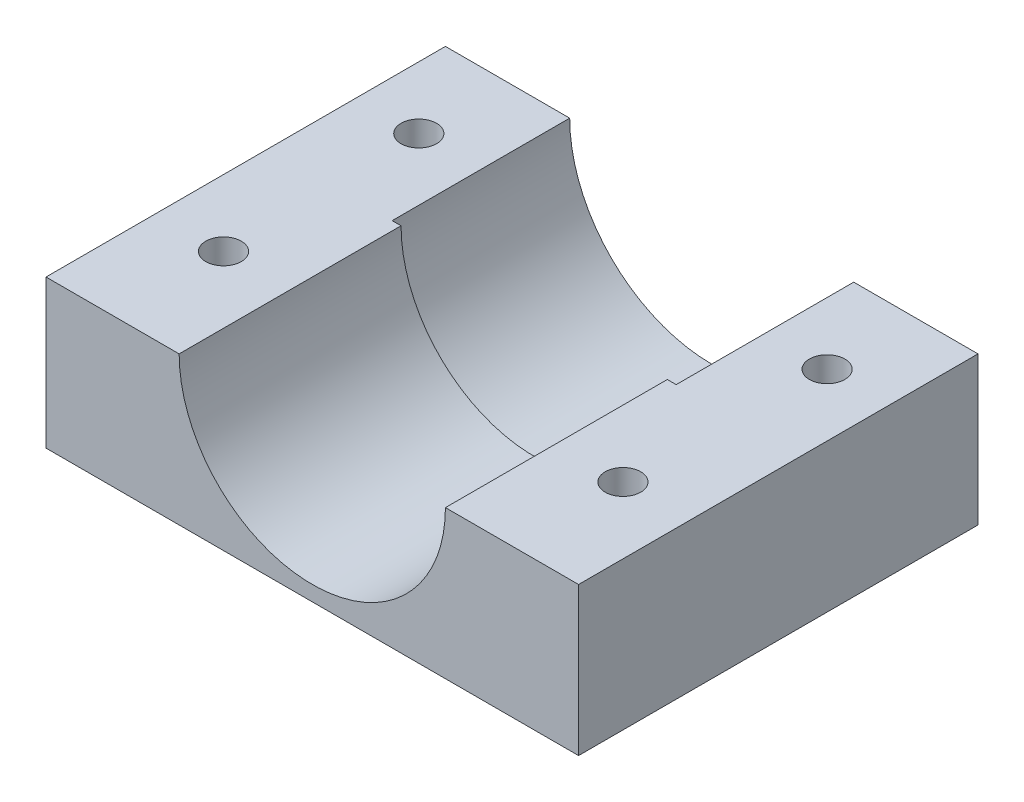
ISO-10303-21;
HEADER;
FILE_DESCRIPTION(('STEP AP214'),'2;1');
FILE_NAME('part.step','',(''),(''),'','','');
FILE_SCHEMA(('AUTOMOTIVE_DESIGN { 1 0 10303 214 1 1 1 1 }'));
ENDSEC;
DATA;
#1=APPLICATION_CONTEXT('core data for automotive mechanical design processes');
#2=APPLICATION_PROTOCOL_DEFINITION('international standard','automotive_design',2000,#1);
#3=PRODUCT_CONTEXT('',#1,'mechanical');
#4=PRODUCT('Part','Part','',(#3));
#5=PRODUCT_RELATED_PRODUCT_CATEGORY('part','',(#4));
#6=PRODUCT_DEFINITION_FORMATION('','',#4);
#7=PRODUCT_DEFINITION_CONTEXT('part definition',#1,'design');
#8=PRODUCT_DEFINITION('design','',#6,#7);
#9=PRODUCT_DEFINITION_SHAPE('','',#8);
#10=(LENGTH_UNIT() NAMED_UNIT(*) SI_UNIT(.MILLI.,.METRE.));
#11=(NAMED_UNIT(*) PLANE_ANGLE_UNIT() SI_UNIT($,.RADIAN.));
#12=(NAMED_UNIT(*) SI_UNIT($,.STERADIAN.) SOLID_ANGLE_UNIT());
#13=UNCERTAINTY_MEASURE_WITH_UNIT(LENGTH_MEASURE(1.E-05),#10,'distance_accuracy_value','');
#14=(GEOMETRIC_REPRESENTATION_CONTEXT(3) GLOBAL_UNCERTAINTY_ASSIGNED_CONTEXT((#13)) GLOBAL_UNIT_ASSIGNED_CONTEXT((#10,
#11,#12)) REPRESENTATION_CONTEXT('',''));
#15=CARTESIAN_POINT('',(0.,0.,0.));
#16=DIRECTION('',(0.,0.,1.));
#17=DIRECTION('',(1.,0.,0.));
#18=AXIS2_PLACEMENT_3D('',#15,#16,#17);
#19=CARTESIAN_POINT('',(-15.,0.,25.));
#20=DIRECTION('',(0.,-1.,0.));
#21=DIRECTION('',(0.,0.,-1.));
#22=AXIS2_PLACEMENT_3D('',#19,#20,#21);
#23=PLANE('',#22);
#24=CARTESIAN_POINT('',(-22.5,0.,12.5));
#25=DIRECTION('',(0.,-1.,0.));
#26=DIRECTION('',(0.,0.,-1.));
#27=AXIS2_PLACEMENT_3D('',#24,#25,#26);
#28=CIRCLE('',#27,2.);
#29=CARTESIAN_POINT('',(-22.5,0.,10.5));
#30=VERTEX_POINT('',#29);
#31=EDGE_CURVE('E182',#30,#30,#28,.F.);
#32=ORIENTED_EDGE('',*,*,#31,.F.);
#33=EDGE_LOOP('',(#32));
#34=FACE_BOUND('',#33,.T.);
#35=CARTESIAN_POINT('',(-23.,0.,-10.));
#36=DIRECTION('',(0.,-1.,0.));
#37=DIRECTION('',(0.,0.,-1.));
#38=AXIS2_PLACEMENT_3D('',#35,#36,#37);
#39=CIRCLE('',#38,2.00000000000001);
#40=CARTESIAN_POINT('',(-23.,0.,-12.));
#41=VERTEX_POINT('',#40);
#42=EDGE_CURVE('E137',#41,#41,#39,.F.);
#43=ORIENTED_EDGE('',*,*,#42,.F.);
#44=EDGE_LOOP('',(#43));
#45=FACE_BOUND('',#44,.T.);
#46=DIRECTION('',(-1.,0.,0.));
#47=VECTOR('',#46,1.);
#48=CARTESIAN_POINT('',(-15.,0.,0.));
#49=LINE('',#48,#47);
#50=CARTESIAN_POINT('',(-15.,0.,0.));
#51=VERTEX_POINT('',#50);
#52=CARTESIAN_POINT('',(-16.,0.,0.));
#53=VERTEX_POINT('',#52);
#54=EDGE_CURVE('E127',#51,#53,#49,.T.);
#55=ORIENTED_EDGE('',*,*,#54,.T.);
#56=DIRECTION('',(0.,0.,1.));
#57=VECTOR('',#56,1.);
#58=CARTESIAN_POINT('',(-16.,0.,-20.));
#59=LINE('',#58,#57);
#60=CARTESIAN_POINT('',(-16.,0.,-20.));
#61=VERTEX_POINT('',#60);
#62=EDGE_CURVE('E49',#61,#53,#59,.T.);
#63=ORIENTED_EDGE('',*,*,#62,.F.);
#64=DIRECTION('',(-1.,0.,0.));
#65=VECTOR('',#64,1.);
#66=CARTESIAN_POINT('',(-20.,0.,-20.));
#67=LINE('',#66,#65);
#68=CARTESIAN_POINT('',(-30.,0.,-20.));
#69=VERTEX_POINT('',#68);
#70=EDGE_CURVE('E189',#61,#69,#67,.T.);
#71=ORIENTED_EDGE('',*,*,#70,.T.);
#72=DIRECTION('',(0.,0.,-1.));
#73=VECTOR('',#72,1.);
#74=CARTESIAN_POINT('',(-30.,0.,25.));
#75=LINE('',#74,#73);
#76=CARTESIAN_POINT('',(-30.,0.,25.));
#77=VERTEX_POINT('',#76);
#78=EDGE_CURVE('E11',#77,#69,#75,.T.);
#79=ORIENTED_EDGE('',*,*,#78,.F.);
#80=DIRECTION('',(-1.,0.,0.));
#81=VECTOR('',#80,1.);
#82=CARTESIAN_POINT('',(-15.,0.,25.));
#83=LINE('',#82,#81);
#84=CARTESIAN_POINT('',(-15.,0.,25.));
#85=VERTEX_POINT('',#84);
#86=EDGE_CURVE('E79',#85,#77,#83,.T.);
#87=ORIENTED_EDGE('',*,*,#86,.F.);
#88=DIRECTION('',(0.,0.,-1.));
#89=VECTOR('',#88,1.);
#90=CARTESIAN_POINT('',(-15.,0.,25.));
#91=LINE('',#90,#89);
#92=EDGE_CURVE('E58',#85,#51,#91,.T.);
#93=ORIENTED_EDGE('',*,*,#92,.T.);
#94=EDGE_LOOP('',(#55,#63,#71,#79,#87,#93));
#95=FACE_BOUND('',#94,.T.);
#96=ADVANCED_FACE('F33',(#34,#45,#95),#23,.F.);
#97=CARTESIAN_POINT('',(-30.,-16.6968195138679,25.));
#98=DIRECTION('',(-1.,0.,0.));
#99=DIRECTION('',(0.,0.,1.));
#100=AXIS2_PLACEMENT_3D('',#97,#98,#99);
#101=PLANE('',#100);
#102=ORIENTED_EDGE('',*,*,#78,.T.);
#103=DIRECTION('',(0.,-1.,0.));
#104=VECTOR('',#103,1.);
#105=CARTESIAN_POINT('',(-30.,-16.6968195138679,-20.));
#106=LINE('',#105,#104);
#107=CARTESIAN_POINT('',(-30.,-16.6968195138679,-20.));
#108=VERTEX_POINT('',#107);
#109=EDGE_CURVE('E199',#69,#108,#106,.T.);
#110=ORIENTED_EDGE('',*,*,#109,.T.);
#111=DIRECTION('',(0.,0.,-1.));
#112=VECTOR('',#111,1.);
#113=CARTESIAN_POINT('',(-30.,-16.6968195138679,25.));
#114=LINE('',#113,#112);
#115=CARTESIAN_POINT('',(-30.,-16.6968195138679,25.));
#116=VERTEX_POINT('',#115);
#117=EDGE_CURVE('E41',#116,#108,#114,.T.);
#118=ORIENTED_EDGE('',*,*,#117,.F.);
#119=DIRECTION('',(0.,1.,0.));
#120=VECTOR('',#119,1.);
#121=CARTESIAN_POINT('',(-30.,-16.6968195138679,25.));
#122=LINE('',#121,#120);
#123=EDGE_CURVE('E144',#116,#77,#122,.T.);
#124=ORIENTED_EDGE('',*,*,#123,.T.);
#125=EDGE_LOOP('',(#102,#110,#118,#124));
#126=FACE_BOUND('',#125,.T.);
#127=ADVANCED_FACE('F173',(#126),#101,.T.);
#128=CARTESIAN_POINT('',(30.,-16.6968195138679,25.));
#129=DIRECTION('',(0.,-1.,0.));
#130=DIRECTION('',(0.,0.,-1.));
#131=AXIS2_PLACEMENT_3D('',#128,#129,#130);
#132=PLANE('',#131);
#133=CARTESIAN_POINT('',(23.,-16.6968195138679,-10.));
#134=DIRECTION('',(0.,-1.,0.));
#135=DIRECTION('',(0.,0.,1.));
#136=AXIS2_PLACEMENT_3D('',#133,#134,#135);
#137=CIRCLE('',#136,2.00000000000001);
#138=CARTESIAN_POINT('',(23.,-16.6968195138679,-7.99999999999999));
#139=VERTEX_POINT('',#138);
#140=EDGE_CURVE('E230',#139,#139,#137,.T.);
#141=ORIENTED_EDGE('',*,*,#140,.F.);
#142=EDGE_LOOP('',(#141));
#143=FACE_BOUND('',#142,.T.);
#144=CARTESIAN_POINT('',(22.5,-16.6968195138679,12.5));
#145=DIRECTION('',(0.,-1.,0.));
#146=DIRECTION('',(0.,0.,1.));
#147=AXIS2_PLACEMENT_3D('',#144,#145,#146);
#148=CIRCLE('',#147,2.);
#149=CARTESIAN_POINT('',(22.5,-16.6968195138679,14.5));
#150=VERTEX_POINT('',#149);
#151=EDGE_CURVE('E224',#150,#150,#148,.T.);
#152=ORIENTED_EDGE('',*,*,#151,.F.);
#153=EDGE_LOOP('',(#152));
#154=FACE_BOUND('',#153,.T.);
#155=CARTESIAN_POINT('',(-22.5,-16.6968195138679,12.5));
#156=DIRECTION('',(0.,-1.,0.));
#157=DIRECTION('',(0.,0.,-1.));
#158=AXIS2_PLACEMENT_3D('',#155,#156,#157);
#159=CIRCLE('',#158,2.);
#160=CARTESIAN_POINT('',(-22.5,-16.6968195138679,10.5));
#161=VERTEX_POINT('',#160);
#162=EDGE_CURVE('E218',#161,#161,#159,.T.);
#163=ORIENTED_EDGE('',*,*,#162,.F.);
#164=EDGE_LOOP('',(#163));
#165=FACE_BOUND('',#164,.T.);
#166=CARTESIAN_POINT('',(-23.,-16.6968195138679,-10.));
#167=DIRECTION('',(0.,-1.,0.));
#168=DIRECTION('',(0.,0.,-1.));
#169=AXIS2_PLACEMENT_3D('',#166,#167,#168);
#170=CIRCLE('',#169,2.00000000000001);
#171=CARTESIAN_POINT('',(-23.,-16.6968195138679,-12.));
#172=VERTEX_POINT('',#171);
#173=EDGE_CURVE('E214',#172,#172,#170,.T.);
#174=ORIENTED_EDGE('',*,*,#173,.F.);
#175=EDGE_LOOP('',(#174));
#176=FACE_BOUND('',#175,.T.);
#177=ORIENTED_EDGE('',*,*,#117,.T.);
#178=DIRECTION('',(1.,0.,0.));
#179=VECTOR('',#178,1.);
#180=CARTESIAN_POINT('',(30.,-16.6968195138679,-20.));
#181=LINE('',#180,#179);
#182=CARTESIAN_POINT('',(30.,-16.6968195138679,-20.));
#183=VERTEX_POINT('',#182);
#184=EDGE_CURVE('E153',#108,#183,#181,.T.);
#185=ORIENTED_EDGE('',*,*,#184,.T.);
#186=DIRECTION('',(0.,0.,-1.));
#187=VECTOR('',#186,1.);
#188=CARTESIAN_POINT('',(30.,-16.6968195138679,25.));
#189=LINE('',#188,#187);
#190=CARTESIAN_POINT('',(30.,-16.6968195138679,25.));
#191=VERTEX_POINT('',#190);
#192=EDGE_CURVE('E112',#191,#183,#189,.T.);
#193=ORIENTED_EDGE('',*,*,#192,.F.);
#194=DIRECTION('',(-1.,0.,0.));
#195=VECTOR('',#194,1.);
#196=CARTESIAN_POINT('',(30.,-16.6968195138679,25.));
#197=LINE('',#196,#195);
#198=EDGE_CURVE('E99',#191,#116,#197,.T.);
#199=ORIENTED_EDGE('',*,*,#198,.T.);
#200=EDGE_LOOP('',(#177,#185,#193,#199));
#201=FACE_BOUND('',#200,.T.);
#202=ADVANCED_FACE('F148',(#143,#154,#165,#176,#201),#132,.T.);
#203=CARTESIAN_POINT('',(30.,-16.6968195138679,25.));
#204=DIRECTION('',(-1.,0.,0.));
#205=DIRECTION('',(0.,0.,1.));
#206=AXIS2_PLACEMENT_3D('',#203,#204,#205);
#207=PLANE('',#206);
#208=ORIENTED_EDGE('',*,*,#192,.T.);
#209=DIRECTION('',(0.,1.,0.));
#210=VECTOR('',#209,1.);
#211=CARTESIAN_POINT('',(30.,0.,-20.));
#212=LINE('',#211,#210);
#213=CARTESIAN_POINT('',(30.,0.,-20.));
#214=VERTEX_POINT('',#213);
#215=EDGE_CURVE('E108',#183,#214,#212,.T.);
#216=ORIENTED_EDGE('',*,*,#215,.T.);
#217=DIRECTION('',(0.,0.,-1.));
#218=VECTOR('',#217,1.);
#219=CARTESIAN_POINT('',(30.,0.,25.));
#220=LINE('',#219,#218);
#221=CARTESIAN_POINT('',(30.,0.,25.));
#222=VERTEX_POINT('',#221);
#223=EDGE_CURVE('E105',#222,#214,#220,.T.);
#224=ORIENTED_EDGE('',*,*,#223,.F.);
#225=DIRECTION('',(0.,1.,0.));
#226=VECTOR('',#225,1.);
#227=CARTESIAN_POINT('',(30.,-16.6968195138679,25.));
#228=LINE('',#227,#226);
#229=EDGE_CURVE('E92',#191,#222,#228,.T.);
#230=ORIENTED_EDGE('',*,*,#229,.F.);
#231=EDGE_LOOP('',(#208,#216,#224,#230));
#232=FACE_BOUND('',#231,.T.);
#233=ADVANCED_FACE('F106',(#232),#207,.F.);
#234=CARTESIAN_POINT('',(30.,0.,25.));
#235=DIRECTION('',(0.,-1.,0.));
#236=DIRECTION('',(1.,0.,0.));
#237=AXIS2_PLACEMENT_3D('',#234,#235,#236);
#238=PLANE('',#237);
#239=CARTESIAN_POINT('',(23.,0.,-10.));
#240=DIRECTION('',(0.,-1.,0.));
#241=DIRECTION('',(0.,0.,-1.));
#242=AXIS2_PLACEMENT_3D('',#239,#240,#241);
#243=CIRCLE('',#242,2.00000000000001);
#244=CARTESIAN_POINT('',(23.,0.,-12.));
#245=VERTEX_POINT('',#244);
#246=EDGE_CURVE('E227',#245,#245,#243,.F.);
#247=ORIENTED_EDGE('',*,*,#246,.F.);
#248=EDGE_LOOP('',(#247));
#249=FACE_BOUND('',#248,.T.);
#250=CARTESIAN_POINT('',(22.5,0.,12.5));
#251=DIRECTION('',(0.,-1.,0.));
#252=DIRECTION('',(0.,0.,-1.));
#253=AXIS2_PLACEMENT_3D('',#250,#251,#252);
#254=CIRCLE('',#253,2.);
#255=CARTESIAN_POINT('',(22.5,0.,10.5));
#256=VERTEX_POINT('',#255);
#257=EDGE_CURVE('E221',#256,#256,#254,.F.);
#258=ORIENTED_EDGE('',*,*,#257,.F.);
#259=EDGE_LOOP('',(#258));
#260=FACE_BOUND('',#259,.T.);
#261=ORIENTED_EDGE('',*,*,#223,.T.);
#262=DIRECTION('',(-1.,0.,0.));
#263=VECTOR('',#262,1.);
#264=CARTESIAN_POINT('',(20.,0.,-20.));
#265=LINE('',#264,#263);
#266=CARTESIAN_POINT('',(16.,0.,-20.));
#267=VERTEX_POINT('',#266);
#268=EDGE_CURVE('E136',#214,#267,#265,.T.);
#269=ORIENTED_EDGE('',*,*,#268,.T.);
#270=DIRECTION('',(0.,0.,1.));
#271=VECTOR('',#270,1.);
#272=CARTESIAN_POINT('',(16.,0.,-20.));
#273=LINE('',#272,#271);
#274=CARTESIAN_POINT('',(16.,0.,0.));
#275=VERTEX_POINT('',#274);
#276=EDGE_CURVE('E193',#267,#275,#273,.T.);
#277=ORIENTED_EDGE('',*,*,#276,.T.);
#278=DIRECTION('',(-1.,0.,0.));
#279=VECTOR('',#278,1.);
#280=CARTESIAN_POINT('',(30.,0.,0.));
#281=LINE('',#280,#279);
#282=CARTESIAN_POINT('',(15.,0.,0.));
#283=VERTEX_POINT('',#282);
#284=EDGE_CURVE('E129',#275,#283,#281,.T.);
#285=ORIENTED_EDGE('',*,*,#284,.T.);
#286=DIRECTION('',(0.,0.,-1.));
#287=VECTOR('',#286,1.);
#288=CARTESIAN_POINT('',(15.,0.,25.));
#289=LINE('',#288,#287);
#290=CARTESIAN_POINT('',(15.,0.,25.));
#291=VERTEX_POINT('',#290);
#292=EDGE_CURVE('E113',#291,#283,#289,.T.);
#293=ORIENTED_EDGE('',*,*,#292,.F.);
#294=DIRECTION('',(-1.,0.,0.));
#295=VECTOR('',#294,1.);
#296=CARTESIAN_POINT('',(30.,0.,25.));
#297=LINE('',#296,#295);
#298=EDGE_CURVE('E96',#222,#291,#297,.T.);
#299=ORIENTED_EDGE('',*,*,#298,.F.);
#300=EDGE_LOOP('',(#261,#269,#277,#285,#293,#299));
#301=FACE_BOUND('',#300,.T.);
#302=ADVANCED_FACE('F115',(#249,#260,#301),#238,.F.);
#303=CARTESIAN_POINT('',(0.,0.,25.));
#304=DIRECTION('',(0.,0.,-1.));
#305=DIRECTION('',(-1.,0.,0.));
#306=AXIS2_PLACEMENT_3D('',#303,#304,#305);
#307=CYLINDRICAL_SURFACE('',#306,15.);
#308=CARTESIAN_POINT('',(0.,0.,0.));
#309=DIRECTION('',(0.,0.,1.));
#310=DIRECTION('',(1.,0.,0.));
#311=AXIS2_PLACEMENT_3D('',#308,#309,#310);
#312=CIRCLE('',#311,15.);
#313=EDGE_CURVE('E132',#51,#283,#312,.T.);
#314=ORIENTED_EDGE('',*,*,#313,.F.);
#315=ORIENTED_EDGE('',*,*,#92,.F.);
#316=CARTESIAN_POINT('',(0.,0.,25.));
#317=DIRECTION('',(0.,0.,1.));
#318=DIRECTION('',(1.,0.,0.));
#319=AXIS2_PLACEMENT_3D('',#316,#317,#318);
#320=CIRCLE('',#319,15.);
#321=EDGE_CURVE('E117',#85,#291,#320,.T.);
#322=ORIENTED_EDGE('',*,*,#321,.T.);
#323=ORIENTED_EDGE('',*,*,#292,.T.);
#324=EDGE_LOOP('',(#314,#315,#322,#323));
#325=FACE_BOUND('',#324,.T.);
#326=ADVANCED_FACE('F161',(#325),#307,.F.);
#327=CARTESIAN_POINT('',(0.,0.,25.));
#328=DIRECTION('',(0.,0.,1.));
#329=DIRECTION('',(1.,0.,0.));
#330=AXIS2_PLACEMENT_3D('',#327,#328,#329);
#331=PLANE('',#330);
#332=ORIENTED_EDGE('',*,*,#86,.T.);
#333=ORIENTED_EDGE('',*,*,#123,.F.);
#334=ORIENTED_EDGE('',*,*,#198,.F.);
#335=ORIENTED_EDGE('',*,*,#229,.T.);
#336=ORIENTED_EDGE('',*,*,#298,.T.);
#337=ORIENTED_EDGE('',*,*,#321,.F.);
#338=EDGE_LOOP('',(#332,#333,#334,#335,#336,#337));
#339=FACE_BOUND('',#338,.T.);
#340=ADVANCED_FACE('F94',(#339),#331,.T.);
#341=CARTESIAN_POINT('',(0.,0.,0.));
#342=DIRECTION('',(0.,0.,1.));
#343=DIRECTION('',(1.,0.,0.));
#344=AXIS2_PLACEMENT_3D('',#341,#342,#343);
#345=PLANE('',#344);
#346=ORIENTED_EDGE('',*,*,#284,.F.);
#347=CARTESIAN_POINT('',(0.,0.,0.));
#348=DIRECTION('',(0.,0.,-1.));
#349=DIRECTION('',(1.,0.,0.));
#350=AXIS2_PLACEMENT_3D('',#347,#348,#349);
#351=CIRCLE('',#350,16.);
#352=EDGE_CURVE('E133',#275,#53,#351,.T.);
#353=ORIENTED_EDGE('',*,*,#352,.T.);
#354=ORIENTED_EDGE('',*,*,#54,.F.);
#355=ORIENTED_EDGE('',*,*,#313,.T.);
#356=EDGE_LOOP('',(#346,#353,#354,#355));
#357=FACE_BOUND('',#356,.T.);
#358=ADVANCED_FACE('F160',(#357),#345,.F.);
#359=CARTESIAN_POINT('',(0.,0.,-20.));
#360=DIRECTION('',(0.,0.,1.));
#361=DIRECTION('',(1.,0.,0.));
#362=AXIS2_PLACEMENT_3D('',#359,#360,#361);
#363=CYLINDRICAL_SURFACE('',#362,16.);
#364=ORIENTED_EDGE('',*,*,#352,.F.);
#365=ORIENTED_EDGE('',*,*,#276,.F.);
#366=CARTESIAN_POINT('',(0.,0.,-20.));
#367=DIRECTION('',(0.,0.,-1.));
#368=DIRECTION('',(1.,0.,0.));
#369=AXIS2_PLACEMENT_3D('',#366,#367,#368);
#370=CIRCLE('',#369,16.);
#371=EDGE_CURVE('E197',#267,#61,#370,.T.);
#372=ORIENTED_EDGE('',*,*,#371,.T.);
#373=ORIENTED_EDGE('',*,*,#62,.T.);
#374=EDGE_LOOP('',(#364,#365,#372,#373));
#375=FACE_BOUND('',#374,.T.);
#376=ADVANCED_FACE('F202',(#375),#363,.F.);
#377=CARTESIAN_POINT('',(0.,0.,-20.));
#378=DIRECTION('',(0.,0.,1.));
#379=DIRECTION('',(1.,0.,0.));
#380=AXIS2_PLACEMENT_3D('',#377,#378,#379);
#381=PLANE('',#380);
#382=ORIENTED_EDGE('',*,*,#268,.F.);
#383=ORIENTED_EDGE('',*,*,#215,.F.);
#384=ORIENTED_EDGE('',*,*,#184,.F.);
#385=ORIENTED_EDGE('',*,*,#109,.F.);
#386=ORIENTED_EDGE('',*,*,#70,.F.);
#387=ORIENTED_EDGE('',*,*,#371,.F.);
#388=EDGE_LOOP('',(#382,#383,#384,#385,#386,#387));
#389=FACE_BOUND('',#388,.T.);
#390=ADVANCED_FACE('F196',(#389),#381,.F.);
#391=CARTESIAN_POINT('',(-23.,5.65685424949239,-10.));
#392=DIRECTION('',(0.,-1.,0.));
#393=DIRECTION('',(0.,0.,-1.));
#394=AXIS2_PLACEMENT_3D('',#391,#392,#393);
#395=CYLINDRICAL_SURFACE('',#394,2.00000000000001);
#396=ORIENTED_EDGE('',*,*,#42,.T.);
#397=EDGE_LOOP('',(#396));
#398=FACE_BOUND('',#397,.T.);
#399=ORIENTED_EDGE('',*,*,#173,.T.);
#400=EDGE_LOOP('',(#399));
#401=FACE_BOUND('',#400,.T.);
#402=ADVANCED_FACE('F245',(#398,#401),#395,.F.);
#403=CARTESIAN_POINT('',(-22.5,5.65685424949239,12.5));
#404=DIRECTION('',(0.,-1.,0.));
#405=DIRECTION('',(0.,0.,-1.));
#406=AXIS2_PLACEMENT_3D('',#403,#404,#405);
#407=CYLINDRICAL_SURFACE('',#406,2.);
#408=ORIENTED_EDGE('',*,*,#31,.T.);
#409=EDGE_LOOP('',(#408));
#410=FACE_BOUND('',#409,.T.);
#411=ORIENTED_EDGE('',*,*,#162,.T.);
#412=EDGE_LOOP('',(#411));
#413=FACE_BOUND('',#412,.T.);
#414=ADVANCED_FACE('F247',(#410,#413),#407,.F.);
#415=CARTESIAN_POINT('',(22.5,5.65685424949239,12.5));
#416=DIRECTION('',(0.,-1.,0.));
#417=DIRECTION('',(0.,0.,-1.));
#418=AXIS2_PLACEMENT_3D('',#415,#416,#417);
#419=CYLINDRICAL_SURFACE('',#418,2.);
#420=ORIENTED_EDGE('',*,*,#257,.T.);
#421=EDGE_LOOP('',(#420));
#422=FACE_BOUND('',#421,.T.);
#423=ORIENTED_EDGE('',*,*,#151,.T.);
#424=EDGE_LOOP('',(#423));
#425=FACE_BOUND('',#424,.T.);
#426=ADVANCED_FACE('F254',(#422,#425),#419,.F.);
#427=CARTESIAN_POINT('',(23.,5.65685424949239,-10.));
#428=DIRECTION('',(0.,-1.,0.));
#429=DIRECTION('',(0.,0.,-1.));
#430=AXIS2_PLACEMENT_3D('',#427,#428,#429);
#431=CYLINDRICAL_SURFACE('',#430,2.00000000000001);
#432=ORIENTED_EDGE('',*,*,#246,.T.);
#433=EDGE_LOOP('',(#432));
#434=FACE_BOUND('',#433,.T.);
#435=ORIENTED_EDGE('',*,*,#140,.T.);
#436=EDGE_LOOP('',(#435));
#437=FACE_BOUND('',#436,.T.);
#438=ADVANCED_FACE('F234',(#434,#437),#431,.F.);
#439=CLOSED_SHELL('',(#96,#127,#202,#233,#302,#326,#340,#358,#376,#390,#402,#414,#426,#438));
#440=MANIFOLD_SOLID_BREP('B2',#439);
#441=ADVANCED_BREP_SHAPE_REPRESENTATION('',(#18,#440),#14);
#442=SHAPE_DEFINITION_REPRESENTATION(#9,#441);
ENDSEC;
END-ISO-10303-21;
